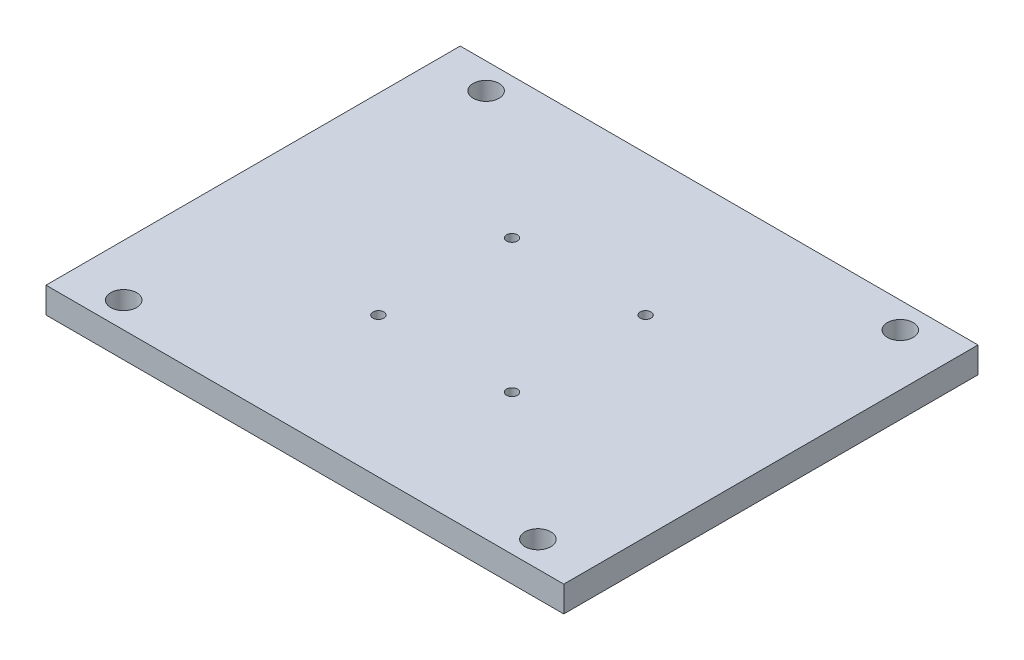
ISO-10303-21;
HEADER;
FILE_DESCRIPTION(('STEP AP214'),'2;1');
FILE_NAME('part.step','',(''),(''),'','','');
FILE_SCHEMA(('AUTOMOTIVE_DESIGN { 1 0 10303 214 1 1 1 1 }'));
ENDSEC;
DATA;
#1=APPLICATION_CONTEXT('core data for automotive mechanical design processes');
#2=APPLICATION_PROTOCOL_DEFINITION('international standard','automotive_design',2000,#1);
#3=PRODUCT_CONTEXT('',#1,'mechanical');
#4=PRODUCT('Part','Part','',(#3));
#5=PRODUCT_RELATED_PRODUCT_CATEGORY('part','',(#4));
#6=PRODUCT_DEFINITION_FORMATION('','',#4);
#7=PRODUCT_DEFINITION_CONTEXT('part definition',#1,'design');
#8=PRODUCT_DEFINITION('design','',#6,#7);
#9=PRODUCT_DEFINITION_SHAPE('','',#8);
#10=(LENGTH_UNIT() NAMED_UNIT(*) SI_UNIT(.MILLI.,.METRE.));
#11=(NAMED_UNIT(*) PLANE_ANGLE_UNIT() SI_UNIT($,.RADIAN.));
#12=(NAMED_UNIT(*) SI_UNIT($,.STERADIAN.) SOLID_ANGLE_UNIT());
#13=UNCERTAINTY_MEASURE_WITH_UNIT(LENGTH_MEASURE(1.E-05),#10,'distance_accuracy_value','');
#14=(GEOMETRIC_REPRESENTATION_CONTEXT(3) GLOBAL_UNCERTAINTY_ASSIGNED_CONTEXT((#13)) GLOBAL_UNIT_ASSIGNED_CONTEXT((#10,
#11,#12)) REPRESENTATION_CONTEXT('',''));
#15=CARTESIAN_POINT('',(0.,0.,0.));
#16=DIRECTION('',(0.,0.,1.));
#17=DIRECTION('',(1.,0.,0.));
#18=AXIS2_PLACEMENT_3D('',#15,#16,#17);
#19=CARTESIAN_POINT('',(0.,-5.,0.));
#20=DIRECTION('',(-1.,0.,0.));
#21=DIRECTION('',(0.,0.,1.));
#22=AXIS2_PLACEMENT_3D('',#19,#20,#21);
#23=PLANE('',#22);
#24=DIRECTION('',(0.,1.,0.));
#25=VECTOR('',#24,1.);
#26=CARTESIAN_POINT('',(0.,-5.,0.));
#27=LINE('',#26,#25);
#28=CARTESIAN_POINT('',(0.,-5.,0.));
#29=VERTEX_POINT('',#28);
#30=CARTESIAN_POINT('',(0.,5.,0.));
#31=VERTEX_POINT('',#30);
#32=EDGE_CURVE('E35',#29,#31,#27,.T.);
#33=ORIENTED_EDGE('',*,*,#32,.T.);
#34=DIRECTION('',(0.,0.,1.));
#35=VECTOR('',#34,1.);
#36=CARTESIAN_POINT('',(0.,5.,0.));
#37=LINE('',#36,#35);
#38=CARTESIAN_POINT('',(0.,5.,-160.));
#39=VERTEX_POINT('',#38);
#40=EDGE_CURVE('E72',#39,#31,#37,.T.);
#41=ORIENTED_EDGE('',*,*,#40,.F.);
#42=DIRECTION('',(0.,1.,0.));
#43=VECTOR('',#42,1.);
#44=CARTESIAN_POINT('',(0.,-5.,-160.));
#45=LINE('',#44,#43);
#46=CARTESIAN_POINT('',(0.,-5.,-160.));
#47=VERTEX_POINT('',#46);
#48=EDGE_CURVE('E11',#47,#39,#45,.T.);
#49=ORIENTED_EDGE('',*,*,#48,.F.);
#50=DIRECTION('',(0.,0.,1.));
#51=VECTOR('',#50,1.);
#52=CARTESIAN_POINT('',(0.,-5.,0.));
#53=LINE('',#52,#51);
#54=EDGE_CURVE('E73',#47,#29,#53,.T.);
#55=ORIENTED_EDGE('',*,*,#54,.T.);
#56=EDGE_LOOP('',(#33,#41,#49,#55));
#57=FACE_BOUND('',#56,.T.);
#58=ADVANCED_FACE('F32',(#57),#23,.T.);
#59=CARTESIAN_POINT('',(0.,-5.,-160.));
#60=DIRECTION('',(0.,0.,-1.));
#61=DIRECTION('',(-1.,0.,0.));
#62=AXIS2_PLACEMENT_3D('',#59,#60,#61);
#63=PLANE('',#62);
#64=ORIENTED_EDGE('',*,*,#48,.T.);
#65=DIRECTION('',(-1.,0.,0.));
#66=VECTOR('',#65,1.);
#67=CARTESIAN_POINT('',(0.,5.,-160.));
#68=LINE('',#67,#66);
#69=CARTESIAN_POINT('',(200.,5.,-160.));
#70=VERTEX_POINT('',#69);
#71=EDGE_CURVE('E89',#70,#39,#68,.T.);
#72=ORIENTED_EDGE('',*,*,#71,.F.);
#73=DIRECTION('',(0.,1.,0.));
#74=VECTOR('',#73,1.);
#75=CARTESIAN_POINT('',(200.,-5.,-160.));
#76=LINE('',#75,#74);
#77=CARTESIAN_POINT('',(200.,-5.,-160.));
#78=VERTEX_POINT('',#77);
#79=EDGE_CURVE('E40',#78,#70,#76,.T.);
#80=ORIENTED_EDGE('',*,*,#79,.F.);
#81=DIRECTION('',(-1.,0.,0.));
#82=VECTOR('',#81,1.);
#83=CARTESIAN_POINT('',(0.,-5.,-160.));
#84=LINE('',#83,#82);
#85=EDGE_CURVE('E78',#78,#47,#84,.T.);
#86=ORIENTED_EDGE('',*,*,#85,.T.);
#87=EDGE_LOOP('',(#64,#72,#80,#86));
#88=FACE_BOUND('',#87,.T.);
#89=ADVANCED_FACE('F109',(#88),#63,.T.);
#90=CARTESIAN_POINT('',(200.,-5.,0.));
#91=DIRECTION('',(1.,0.,0.));
#92=DIRECTION('',(0.,0.,-1.));
#93=AXIS2_PLACEMENT_3D('',#90,#91,#92);
#94=PLANE('',#93);
#95=ORIENTED_EDGE('',*,*,#79,.T.);
#96=DIRECTION('',(0.,0.,-1.));
#97=VECTOR('',#96,1.);
#98=CARTESIAN_POINT('',(200.,5.,0.));
#99=LINE('',#98,#97);
#100=CARTESIAN_POINT('',(200.,5.,0.));
#101=VERTEX_POINT('',#100);
#102=EDGE_CURVE('E85',#101,#70,#99,.T.);
#103=ORIENTED_EDGE('',*,*,#102,.F.);
#104=DIRECTION('',(0.,1.,0.));
#105=VECTOR('',#104,1.);
#106=CARTESIAN_POINT('',(200.,-5.,0.));
#107=LINE('',#106,#105);
#108=CARTESIAN_POINT('',(200.,-5.,0.));
#109=VERTEX_POINT('',#108);
#110=EDGE_CURVE('E77',#109,#101,#107,.T.);
#111=ORIENTED_EDGE('',*,*,#110,.F.);
#112=DIRECTION('',(0.,0.,-1.));
#113=VECTOR('',#112,1.);
#114=CARTESIAN_POINT('',(200.,-5.,0.));
#115=LINE('',#114,#113);
#116=EDGE_CURVE('E102',#109,#78,#115,.T.);
#117=ORIENTED_EDGE('',*,*,#116,.T.);
#118=EDGE_LOOP('',(#95,#103,#111,#117));
#119=FACE_BOUND('',#118,.T.);
#120=ADVANCED_FACE('F106',(#119),#94,.T.);
#121=CARTESIAN_POINT('',(0.,-5.,0.));
#122=DIRECTION('',(0.,0.,1.));
#123=DIRECTION('',(1.,0.,0.));
#124=AXIS2_PLACEMENT_3D('',#121,#122,#123);
#125=PLANE('',#124);
#126=ORIENTED_EDGE('',*,*,#110,.T.);
#127=DIRECTION('',(1.,0.,0.));
#128=VECTOR('',#127,1.);
#129=CARTESIAN_POINT('',(0.,5.,0.));
#130=LINE('',#129,#128);
#131=EDGE_CURVE('E80',#31,#101,#130,.T.);
#132=ORIENTED_EDGE('',*,*,#131,.F.);
#133=ORIENTED_EDGE('',*,*,#32,.F.);
#134=DIRECTION('',(1.,0.,0.));
#135=VECTOR('',#134,1.);
#136=CARTESIAN_POINT('',(0.,-5.,0.));
#137=LINE('',#136,#135);
#138=EDGE_CURVE('E100',#29,#109,#137,.T.);
#139=ORIENTED_EDGE('',*,*,#138,.T.);
#140=EDGE_LOOP('',(#126,#132,#133,#139));
#141=FACE_BOUND('',#140,.T.);
#142=ADVANCED_FACE('F81',(#141),#125,.T.);
#143=CARTESIAN_POINT('',(0.,-5.,0.));
#144=DIRECTION('',(0.,-1.,0.));
#145=DIRECTION('',(0.,0.,-1.));
#146=AXIS2_PLACEMENT_3D('',#143,#144,#145);
#147=PLANE('',#146);
#148=CARTESIAN_POINT('',(20.,-5.,-150.));
#149=DIRECTION('',(0.,1.,0.));
#150=DIRECTION('',(0.,0.,1.));
#151=AXIS2_PLACEMENT_3D('',#148,#149,#150);
#152=CIRCLE('',#151,5.00000000000001);
#153=CARTESIAN_POINT('',(20.,-5.,-145.));
#154=VERTEX_POINT('',#153);
#155=EDGE_CURVE('E234',#154,#154,#152,.T.);
#156=ORIENTED_EDGE('',*,*,#155,.T.);
#157=EDGE_LOOP('',(#156));
#158=FACE_BOUND('',#157,.T.);
#159=CARTESIAN_POINT('',(20.,-5.,-10.));
#160=DIRECTION('',(0.,1.,0.));
#161=DIRECTION('',(0.,0.,1.));
#162=AXIS2_PLACEMENT_3D('',#159,#160,#161);
#163=CIRCLE('',#162,5.);
#164=CARTESIAN_POINT('',(20.,-5.,-5.));
#165=VERTEX_POINT('',#164);
#166=EDGE_CURVE('E242',#165,#165,#163,.T.);
#167=ORIENTED_EDGE('',*,*,#166,.T.);
#168=EDGE_LOOP('',(#167));
#169=FACE_BOUND('',#168,.T.);
#170=CARTESIAN_POINT('',(125.802326445497,-5.,-105.802326445498));
#171=DIRECTION('',(0.,1.,0.));
#172=DIRECTION('',(0.,0.,1.));
#173=AXIS2_PLACEMENT_3D('',#170,#171,#172);
#174=CIRCLE('',#173,2.10000000000002);
#175=CARTESIAN_POINT('',(125.802326445497,-5.,-103.702326445498));
#176=VERTEX_POINT('',#175);
#177=EDGE_CURVE('E248',#176,#176,#174,.T.);
#178=ORIENTED_EDGE('',*,*,#177,.T.);
#179=EDGE_LOOP('',(#178));
#180=FACE_BOUND('',#179,.T.);
#181=CARTESIAN_POINT('',(125.802326445497,-5.,-54.1976735545032));
#182=DIRECTION('',(0.,1.,0.));
#183=DIRECTION('',(0.,0.,1.));
#184=AXIS2_PLACEMENT_3D('',#181,#182,#183);
#185=CIRCLE('',#184,2.10000000000002);
#186=CARTESIAN_POINT('',(125.802326445497,-5.,-52.0976735545032));
#187=VERTEX_POINT('',#186);
#188=EDGE_CURVE('E254',#187,#187,#185,.T.);
#189=ORIENTED_EDGE('',*,*,#188,.T.);
#190=EDGE_LOOP('',(#189));
#191=FACE_BOUND('',#190,.T.);
#192=CARTESIAN_POINT('',(74.197673554503,-5.,-54.1976735545028));
#193=DIRECTION('',(0.,1.,0.));
#194=DIRECTION('',(0.,0.,1.));
#195=AXIS2_PLACEMENT_3D('',#192,#193,#194);
#196=CIRCLE('',#195,2.09999999999999);
#197=CARTESIAN_POINT('',(74.197673554503,-5.,-52.0976735545028));
#198=VERTEX_POINT('',#197);
#199=EDGE_CURVE('E260',#198,#198,#196,.T.);
#200=ORIENTED_EDGE('',*,*,#199,.T.);
#201=EDGE_LOOP('',(#200));
#202=FACE_BOUND('',#201,.T.);
#203=CARTESIAN_POINT('',(74.1976735545029,-5.,-105.802326445497));
#204=DIRECTION('',(0.,1.,0.));
#205=DIRECTION('',(0.,0.,1.));
#206=AXIS2_PLACEMENT_3D('',#203,#204,#205);
#207=CIRCLE('',#206,2.1);
#208=CARTESIAN_POINT('',(74.1976735545029,-5.,-103.702326445497));
#209=VERTEX_POINT('',#208);
#210=EDGE_CURVE('E266',#209,#209,#207,.T.);
#211=ORIENTED_EDGE('',*,*,#210,.T.);
#212=EDGE_LOOP('',(#211));
#213=FACE_BOUND('',#212,.T.);
#214=CARTESIAN_POINT('',(180.,-5.,-10.));
#215=DIRECTION('',(0.,1.,0.));
#216=DIRECTION('',(0.,0.,1.));
#217=AXIS2_PLACEMENT_3D('',#214,#215,#216);
#218=CIRCLE('',#217,4.99999999999999);
#219=CARTESIAN_POINT('',(180.,-5.,-5.00000000000001));
#220=VERTEX_POINT('',#219);
#221=EDGE_CURVE('E272',#220,#220,#218,.T.);
#222=ORIENTED_EDGE('',*,*,#221,.T.);
#223=EDGE_LOOP('',(#222));
#224=FACE_BOUND('',#223,.T.);
#225=CARTESIAN_POINT('',(180.,-5.,-150.));
#226=DIRECTION('',(0.,1.,0.));
#227=DIRECTION('',(0.,0.,1.));
#228=AXIS2_PLACEMENT_3D('',#225,#226,#227);
#229=CIRCLE('',#228,5.00000000000002);
#230=CARTESIAN_POINT('',(180.,-5.,-145.));
#231=VERTEX_POINT('',#230);
#232=EDGE_CURVE('E90',#231,#231,#229,.T.);
#233=ORIENTED_EDGE('',*,*,#232,.T.);
#234=EDGE_LOOP('',(#233));
#235=FACE_BOUND('',#234,.T.);
#236=ORIENTED_EDGE('',*,*,#54,.F.);
#237=ORIENTED_EDGE('',*,*,#85,.F.);
#238=ORIENTED_EDGE('',*,*,#116,.F.);
#239=ORIENTED_EDGE('',*,*,#138,.F.);
#240=EDGE_LOOP('',(#236,#237,#238,#239));
#241=FACE_BOUND('',#240,.T.);
#242=ADVANCED_FACE('F111',(#158,#169,#180,#191,#202,#213,#224,#235,#241),#147,.T.);
#243=CARTESIAN_POINT('',(0.,5.,0.));
#244=DIRECTION('',(0.,-1.,0.));
#245=DIRECTION('',(0.,0.,-1.));
#246=AXIS2_PLACEMENT_3D('',#243,#244,#245);
#247=PLANE('',#246);
#248=CARTESIAN_POINT('',(20.,5.,-150.));
#249=DIRECTION('',(0.,1.,0.));
#250=DIRECTION('',(0.,0.,1.));
#251=AXIS2_PLACEMENT_3D('',#248,#249,#250);
#252=CIRCLE('',#251,5.00000000000001);
#253=CARTESIAN_POINT('',(20.,5.,-145.));
#254=VERTEX_POINT('',#253);
#255=EDGE_CURVE('E237',#254,#254,#252,.T.);
#256=ORIENTED_EDGE('',*,*,#255,.F.);
#257=EDGE_LOOP('',(#256));
#258=FACE_BOUND('',#257,.T.);
#259=CARTESIAN_POINT('',(20.,5.,-10.));
#260=DIRECTION('',(0.,1.,0.));
#261=DIRECTION('',(0.,0.,1.));
#262=AXIS2_PLACEMENT_3D('',#259,#260,#261);
#263=CIRCLE('',#262,5.);
#264=CARTESIAN_POINT('',(20.,5.,-5.));
#265=VERTEX_POINT('',#264);
#266=EDGE_CURVE('E239',#265,#265,#263,.T.);
#267=ORIENTED_EDGE('',*,*,#266,.F.);
#268=EDGE_LOOP('',(#267));
#269=FACE_BOUND('',#268,.T.);
#270=CARTESIAN_POINT('',(125.802326445497,5.,-105.802326445498));
#271=DIRECTION('',(0.,1.,0.));
#272=DIRECTION('',(0.,0.,1.));
#273=AXIS2_PLACEMENT_3D('',#270,#271,#272);
#274=CIRCLE('',#273,2.10000000000002);
#275=CARTESIAN_POINT('',(125.802326445497,5.,-103.702326445498));
#276=VERTEX_POINT('',#275);
#277=EDGE_CURVE('E245',#276,#276,#274,.T.);
#278=ORIENTED_EDGE('',*,*,#277,.F.);
#279=EDGE_LOOP('',(#278));
#280=FACE_BOUND('',#279,.T.);
#281=CARTESIAN_POINT('',(125.802326445497,5.,-54.1976735545032));
#282=DIRECTION('',(0.,1.,0.));
#283=DIRECTION('',(0.,0.,1.));
#284=AXIS2_PLACEMENT_3D('',#281,#282,#283);
#285=CIRCLE('',#284,2.10000000000002);
#286=CARTESIAN_POINT('',(125.802326445497,5.,-52.0976735545032));
#287=VERTEX_POINT('',#286);
#288=EDGE_CURVE('E251',#287,#287,#285,.T.);
#289=ORIENTED_EDGE('',*,*,#288,.F.);
#290=EDGE_LOOP('',(#289));
#291=FACE_BOUND('',#290,.T.);
#292=CARTESIAN_POINT('',(74.197673554503,5.,-54.1976735545028));
#293=DIRECTION('',(0.,1.,0.));
#294=DIRECTION('',(0.,0.,1.));
#295=AXIS2_PLACEMENT_3D('',#292,#293,#294);
#296=CIRCLE('',#295,2.09999999999999);
#297=CARTESIAN_POINT('',(74.197673554503,5.,-52.0976735545028));
#298=VERTEX_POINT('',#297);
#299=EDGE_CURVE('E257',#298,#298,#296,.T.);
#300=ORIENTED_EDGE('',*,*,#299,.F.);
#301=EDGE_LOOP('',(#300));
#302=FACE_BOUND('',#301,.T.);
#303=CARTESIAN_POINT('',(74.1976735545029,5.,-105.802326445497));
#304=DIRECTION('',(0.,1.,0.));
#305=DIRECTION('',(0.,0.,1.));
#306=AXIS2_PLACEMENT_3D('',#303,#304,#305);
#307=CIRCLE('',#306,2.1);
#308=CARTESIAN_POINT('',(74.1976735545029,5.,-103.702326445497));
#309=VERTEX_POINT('',#308);
#310=EDGE_CURVE('E263',#309,#309,#307,.T.);
#311=ORIENTED_EDGE('',*,*,#310,.F.);
#312=EDGE_LOOP('',(#311));
#313=FACE_BOUND('',#312,.T.);
#314=CARTESIAN_POINT('',(180.,5.,-10.));
#315=DIRECTION('',(0.,1.,0.));
#316=DIRECTION('',(0.,0.,1.));
#317=AXIS2_PLACEMENT_3D('',#314,#315,#316);
#318=CIRCLE('',#317,4.99999999999999);
#319=CARTESIAN_POINT('',(180.,5.,-5.00000000000001));
#320=VERTEX_POINT('',#319);
#321=EDGE_CURVE('E269',#320,#320,#318,.T.);
#322=ORIENTED_EDGE('',*,*,#321,.F.);
#323=EDGE_LOOP('',(#322));
#324=FACE_BOUND('',#323,.T.);
#325=CARTESIAN_POINT('',(180.,5.,-150.));
#326=DIRECTION('',(0.,1.,0.));
#327=DIRECTION('',(0.,0.,1.));
#328=AXIS2_PLACEMENT_3D('',#325,#326,#327);
#329=CIRCLE('',#328,5.00000000000002);
#330=CARTESIAN_POINT('',(180.,5.,-145.));
#331=VERTEX_POINT('',#330);
#332=EDGE_CURVE('E93',#331,#331,#329,.T.);
#333=ORIENTED_EDGE('',*,*,#332,.F.);
#334=EDGE_LOOP('',(#333));
#335=FACE_BOUND('',#334,.T.);
#336=ORIENTED_EDGE('',*,*,#40,.T.);
#337=ORIENTED_EDGE('',*,*,#131,.T.);
#338=ORIENTED_EDGE('',*,*,#102,.T.);
#339=ORIENTED_EDGE('',*,*,#71,.T.);
#340=EDGE_LOOP('',(#336,#337,#338,#339));
#341=FACE_BOUND('',#340,.T.);
#342=ADVANCED_FACE('F88',(#258,#269,#280,#291,#302,#313,#324,#335,#341),#247,.F.);
#343=CARTESIAN_POINT('',(180.,-5.,-150.));
#344=DIRECTION('',(0.,1.,0.));
#345=DIRECTION('',(0.,0.,1.));
#346=AXIS2_PLACEMENT_3D('',#343,#344,#345);
#347=CYLINDRICAL_SURFACE('',#346,5.00000000000002);
#348=ORIENTED_EDGE('',*,*,#232,.F.);
#349=EDGE_LOOP('',(#348));
#350=FACE_BOUND('',#349,.T.);
#351=ORIENTED_EDGE('',*,*,#332,.T.);
#352=EDGE_LOOP('',(#351));
#353=FACE_BOUND('',#352,.T.);
#354=ADVANCED_FACE('F119',(#350,#353),#347,.F.);
#355=CARTESIAN_POINT('',(180.,-5.,-10.));
#356=DIRECTION('',(0.,1.,0.));
#357=DIRECTION('',(0.,0.,1.));
#358=AXIS2_PLACEMENT_3D('',#355,#356,#357);
#359=CYLINDRICAL_SURFACE('',#358,4.99999999999999);
#360=ORIENTED_EDGE('',*,*,#221,.F.);
#361=EDGE_LOOP('',(#360));
#362=FACE_BOUND('',#361,.T.);
#363=ORIENTED_EDGE('',*,*,#321,.T.);
#364=EDGE_LOOP('',(#363));
#365=FACE_BOUND('',#364,.T.);
#366=ADVANCED_FACE('F158',(#362,#365),#359,.F.);
#367=CARTESIAN_POINT('',(74.1976735545029,-5.,-105.802326445497));
#368=DIRECTION('',(0.,1.,0.));
#369=DIRECTION('',(0.,0.,1.));
#370=AXIS2_PLACEMENT_3D('',#367,#368,#369);
#371=CYLINDRICAL_SURFACE('',#370,2.1);
#372=ORIENTED_EDGE('',*,*,#210,.F.);
#373=EDGE_LOOP('',(#372));
#374=FACE_BOUND('',#373,.T.);
#375=ORIENTED_EDGE('',*,*,#310,.T.);
#376=EDGE_LOOP('',(#375));
#377=FACE_BOUND('',#376,.T.);
#378=ADVANCED_FACE('F168',(#374,#377),#371,.F.);
#379=CARTESIAN_POINT('',(74.197673554503,-5.,-54.1976735545028));
#380=DIRECTION('',(0.,1.,0.));
#381=DIRECTION('',(0.,0.,1.));
#382=AXIS2_PLACEMENT_3D('',#379,#380,#381);
#383=CYLINDRICAL_SURFACE('',#382,2.09999999999999);
#384=ORIENTED_EDGE('',*,*,#199,.F.);
#385=EDGE_LOOP('',(#384));
#386=FACE_BOUND('',#385,.T.);
#387=ORIENTED_EDGE('',*,*,#299,.T.);
#388=EDGE_LOOP('',(#387));
#389=FACE_BOUND('',#388,.T.);
#390=ADVANCED_FACE('F178',(#386,#389),#383,.F.);
#391=CARTESIAN_POINT('',(125.802326445497,-5.,-54.1976735545032));
#392=DIRECTION('',(0.,1.,0.));
#393=DIRECTION('',(0.,0.,1.));
#394=AXIS2_PLACEMENT_3D('',#391,#392,#393);
#395=CYLINDRICAL_SURFACE('',#394,2.10000000000002);
#396=ORIENTED_EDGE('',*,*,#188,.F.);
#397=EDGE_LOOP('',(#396));
#398=FACE_BOUND('',#397,.T.);
#399=ORIENTED_EDGE('',*,*,#288,.T.);
#400=EDGE_LOOP('',(#399));
#401=FACE_BOUND('',#400,.T.);
#402=ADVANCED_FACE('F188',(#398,#401),#395,.F.);
#403=CARTESIAN_POINT('',(125.802326445497,-5.,-105.802326445498));
#404=DIRECTION('',(0.,1.,0.));
#405=DIRECTION('',(0.,0.,1.));
#406=AXIS2_PLACEMENT_3D('',#403,#404,#405);
#407=CYLINDRICAL_SURFACE('',#406,2.10000000000002);
#408=ORIENTED_EDGE('',*,*,#177,.F.);
#409=EDGE_LOOP('',(#408));
#410=FACE_BOUND('',#409,.T.);
#411=ORIENTED_EDGE('',*,*,#277,.T.);
#412=EDGE_LOOP('',(#411));
#413=FACE_BOUND('',#412,.T.);
#414=ADVANCED_FACE('F198',(#410,#413),#407,.F.);
#415=CARTESIAN_POINT('',(20.,-5.,-10.));
#416=DIRECTION('',(0.,1.,0.));
#417=DIRECTION('',(0.,0.,1.));
#418=AXIS2_PLACEMENT_3D('',#415,#416,#417);
#419=CYLINDRICAL_SURFACE('',#418,5.);
#420=ORIENTED_EDGE('',*,*,#166,.F.);
#421=EDGE_LOOP('',(#420));
#422=FACE_BOUND('',#421,.T.);
#423=ORIENTED_EDGE('',*,*,#266,.T.);
#424=EDGE_LOOP('',(#423));
#425=FACE_BOUND('',#424,.T.);
#426=ADVANCED_FACE('F208',(#422,#425),#419,.F.);
#427=CARTESIAN_POINT('',(20.,-5.,-150.));
#428=DIRECTION('',(0.,1.,0.));
#429=DIRECTION('',(0.,0.,1.));
#430=AXIS2_PLACEMENT_3D('',#427,#428,#429);
#431=CYLINDRICAL_SURFACE('',#430,5.00000000000001);
#432=ORIENTED_EDGE('',*,*,#155,.F.);
#433=EDGE_LOOP('',(#432));
#434=FACE_BOUND('',#433,.T.);
#435=ORIENTED_EDGE('',*,*,#255,.T.);
#436=EDGE_LOOP('',(#435));
#437=FACE_BOUND('',#436,.T.);
#438=ADVANCED_FACE('F218',(#434,#437),#431,.F.);
#439=CLOSED_SHELL('',(#58,#89,#120,#142,#242,#342,#354,#366,#378,#390,#402,#414,#426,#438));
#440=MANIFOLD_SOLID_BREP('B2',#439);
#441=ADVANCED_BREP_SHAPE_REPRESENTATION('',(#18,#440),#14);
#442=SHAPE_DEFINITION_REPRESENTATION(#9,#441);
ENDSEC;
END-ISO-10303-21;
